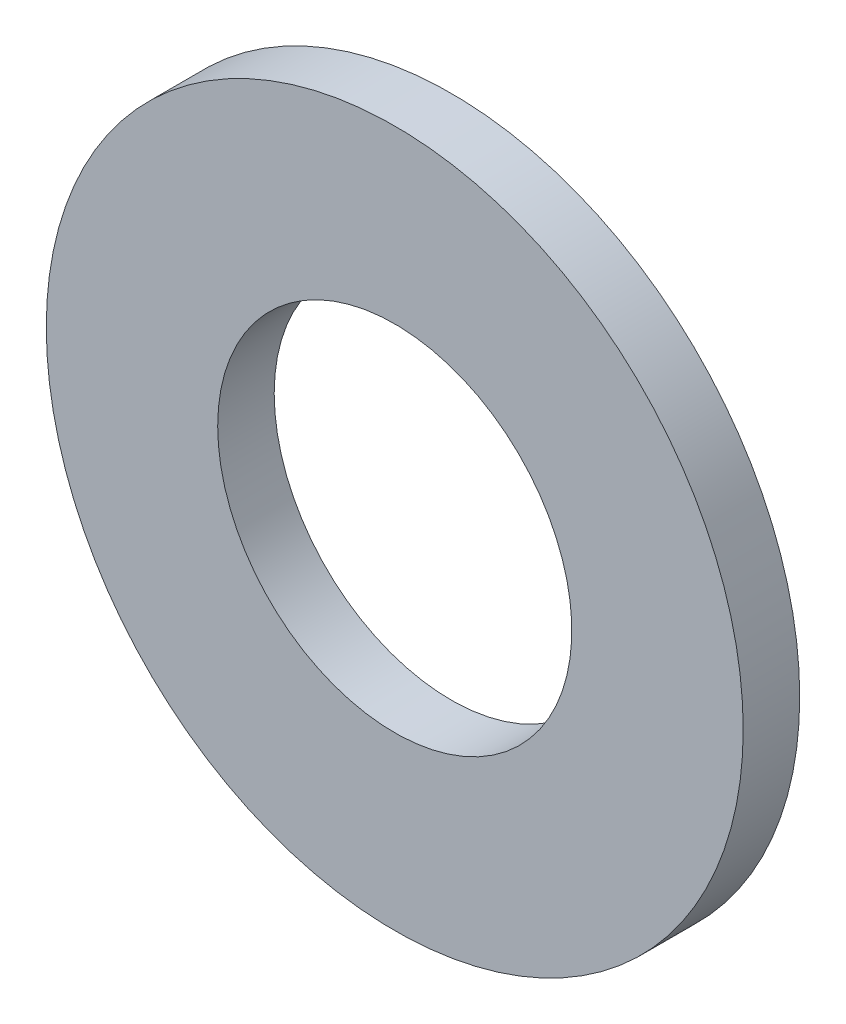
ISO-10303-21;
HEADER;
FILE_DESCRIPTION(('STEP AP214'),'2;1');
FILE_NAME('part.step','',(''),(''),'','','');
FILE_SCHEMA(('AUTOMOTIVE_DESIGN { 1 0 10303 214 1 1 1 1 }'));
ENDSEC;
DATA;
#1=APPLICATION_CONTEXT('core data for automotive mechanical design processes');
#2=APPLICATION_PROTOCOL_DEFINITION('international standard','automotive_design',2000,#1);
#3=PRODUCT_CONTEXT('',#1,'mechanical');
#4=PRODUCT('Part','Part','',(#3));
#5=PRODUCT_RELATED_PRODUCT_CATEGORY('part','',(#4));
#6=PRODUCT_DEFINITION_FORMATION('','',#4);
#7=PRODUCT_DEFINITION_CONTEXT('part definition',#1,'design');
#8=PRODUCT_DEFINITION('design','',#6,#7);
#9=PRODUCT_DEFINITION_SHAPE('','',#8);
#10=(LENGTH_UNIT() NAMED_UNIT(*) SI_UNIT(.MILLI.,.METRE.));
#11=(NAMED_UNIT(*) PLANE_ANGLE_UNIT() SI_UNIT($,.RADIAN.));
#12=(NAMED_UNIT(*) SI_UNIT($,.STERADIAN.) SOLID_ANGLE_UNIT());
#13=UNCERTAINTY_MEASURE_WITH_UNIT(LENGTH_MEASURE(1.E-05),#10,'distance_accuracy_value','');
#14=(GEOMETRIC_REPRESENTATION_CONTEXT(3) GLOBAL_UNCERTAINTY_ASSIGNED_CONTEXT((#13)) GLOBAL_UNIT_ASSIGNED_CONTEXT((#10,
#11,#12)) REPRESENTATION_CONTEXT('',''));
#15=CARTESIAN_POINT('',(0.,0.,0.));
#16=DIRECTION('',(0.,0.,1.));
#17=DIRECTION('',(1.,0.,0.));
#18=AXIS2_PLACEMENT_3D('',#15,#16,#17);
#19=CARTESIAN_POINT('',(15.5154221584307,22.9121126482195,-3.7327226031434));
#20=DIRECTION('',(0.,0.,-1.));
#21=DIRECTION('',(0.,1.,0.));
#22=AXIS2_PLACEMENT_3D('',#19,#20,#21);
#23=PLANE('',#22);
#24=CARTESIAN_POINT('',(16.7063851118081,22.9943664243214,-3.73272260314342));
#25=DIRECTION('',(0.,0.,-1.));
#26=DIRECTION('',(-1.,0.,0.));
#27=AXIS2_PLACEMENT_3D('',#24,#25,#26);
#28=CIRCLE('',#27,2.34950000000004);
#29=CARTESIAN_POINT('',(14.356885111808,22.9943664243214,-3.73272260314342));
#30=VERTEX_POINT('',#29);
#31=EDGE_CURVE('E31',#30,#30,#28,.T.);
#32=ORIENTED_EDGE('',*,*,#31,.F.);
#33=EDGE_LOOP('',(#32));
#34=FACE_BOUND('',#33,.T.);
#35=CARTESIAN_POINT('',(16.7063851118081,22.9943664243214,-3.73272260314342));
#36=DIRECTION('',(0.,0.,-1.));
#37=DIRECTION('',(-1.,0.,0.));
#38=AXIS2_PLACEMENT_3D('',#35,#36,#37);
#39=CIRCLE('',#38,1.19380000000002);
#40=CARTESIAN_POINT('',(15.512585111808,22.9943664243214,-3.73272260314342));
#41=VERTEX_POINT('',#40);
#42=EDGE_CURVE('E18',#41,#41,#39,.T.);
#43=ORIENTED_EDGE('',*,*,#42,.T.);
#44=EDGE_LOOP('',(#43));
#45=FACE_BOUND('',#44,.T.);
#46=ADVANCED_FACE('F15',(#34,#45),#23,.F.);
#47=CARTESIAN_POINT('',(16.706385111808,22.9943664243214,-38.6577226031432));
#48=DIRECTION('',(0.,0.,-1.));
#49=DIRECTION('',(-1.,0.,0.));
#50=AXIS2_PLACEMENT_3D('',#47,#48,#49);
#51=CYLINDRICAL_SURFACE('',#50,1.19380000000002);
#52=ORIENTED_EDGE('',*,*,#42,.F.);
#53=EDGE_LOOP('',(#52));
#54=FACE_BOUND('',#53,.T.);
#55=CARTESIAN_POINT('',(16.7063851118081,22.9943664243214,-4.11372260314342));
#56=DIRECTION('',(0.,0.,-1.));
#57=DIRECTION('',(-1.,0.,0.));
#58=AXIS2_PLACEMENT_3D('',#55,#56,#57);
#59=CIRCLE('',#58,1.19380000000002);
#60=CARTESIAN_POINT('',(15.512585111808,22.9943664243214,-4.11372260314342));
#61=VERTEX_POINT('',#60);
#62=EDGE_CURVE('E23',#61,#61,#59,.T.);
#63=ORIENTED_EDGE('',*,*,#62,.T.);
#64=EDGE_LOOP('',(#63));
#65=FACE_BOUND('',#64,.T.);
#66=ADVANCED_FACE('F40',(#54,#65),#51,.F.);
#67=CARTESIAN_POINT('',(16.706385111808,22.9943664243214,-38.6577226031432));
#68=DIRECTION('',(0.,0.,-1.));
#69=DIRECTION('',(-1.,0.,0.));
#70=AXIS2_PLACEMENT_3D('',#67,#68,#69);
#71=CYLINDRICAL_SURFACE('',#70,2.34950000000004);
#72=CARTESIAN_POINT('',(16.7063851118081,22.9943664243214,-4.11372260314342));
#73=DIRECTION('',(0.,0.,-1.));
#74=DIRECTION('',(-1.,0.,0.));
#75=AXIS2_PLACEMENT_3D('',#72,#73,#74);
#76=CIRCLE('',#75,2.34950000000004);
#77=CARTESIAN_POINT('',(14.356885111808,22.9943664243214,-4.11372260314342));
#78=VERTEX_POINT('',#77);
#79=EDGE_CURVE('E10',#78,#78,#76,.F.);
#80=ORIENTED_EDGE('',*,*,#79,.T.);
#81=EDGE_LOOP('',(#80));
#82=FACE_BOUND('',#81,.T.);
#83=ORIENTED_EDGE('',*,*,#31,.T.);
#84=EDGE_LOOP('',(#83));
#85=FACE_BOUND('',#84,.T.);
#86=ADVANCED_FACE('F43',(#82,#85),#71,.T.);
#87=CARTESIAN_POINT('',(14.3624686610124,22.8324839926316,-4.11372260314337));
#88=DIRECTION('',(0.,0.,1.));
#89=DIRECTION('',(0.,-1.,0.));
#90=AXIS2_PLACEMENT_3D('',#87,#88,#89);
#91=PLANE('',#90);
#92=ORIENTED_EDGE('',*,*,#79,.F.);
#93=EDGE_LOOP('',(#92));
#94=FACE_BOUND('',#93,.T.);
#95=ORIENTED_EDGE('',*,*,#62,.F.);
#96=EDGE_LOOP('',(#95));
#97=FACE_BOUND('',#96,.T.);
#98=ADVANCED_FACE('F46',(#94,#97),#91,.F.);
#99=CLOSED_SHELL('',(#46,#66,#86,#98));
#100=MANIFOLD_SOLID_BREP('B1',#99);
#101=ADVANCED_BREP_SHAPE_REPRESENTATION('',(#18,#100),#14);
#102=SHAPE_DEFINITION_REPRESENTATION(#9,#101);
ENDSEC;
END-ISO-10303-21;
